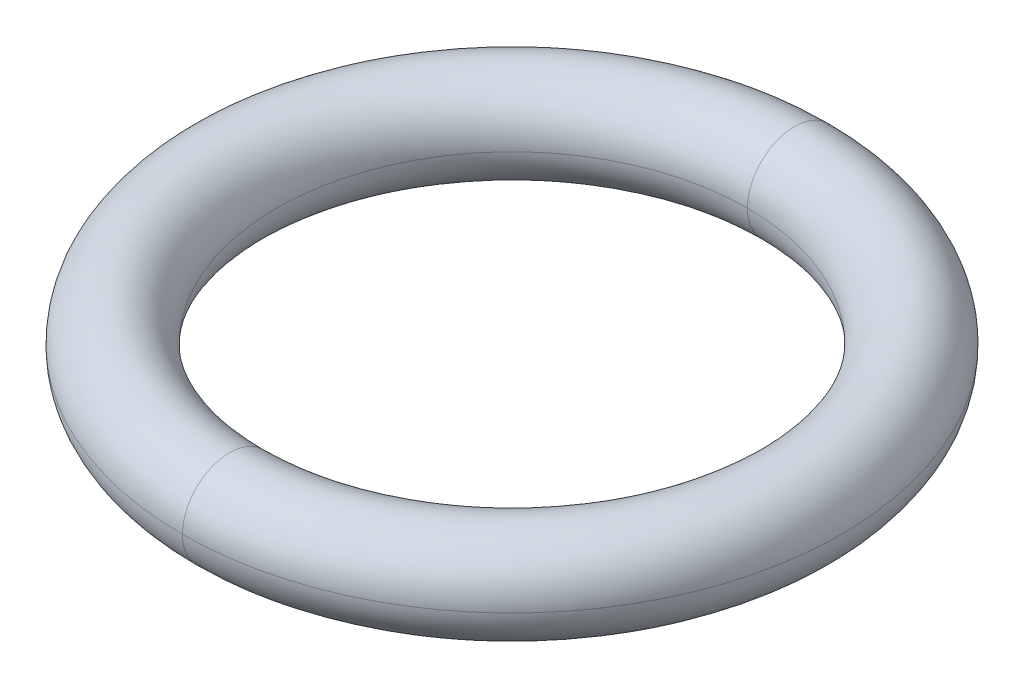
ISO-10303-21;
HEADER;
FILE_DESCRIPTION(('STEP AP214'),'2;1');
FILE_NAME('part.step','',(''),(''),'','','');
FILE_SCHEMA(('AUTOMOTIVE_DESIGN { 1 0 10303 214 1 1 1 1 }'));
ENDSEC;
DATA;
#1=APPLICATION_CONTEXT('core data for automotive mechanical design processes');
#2=APPLICATION_PROTOCOL_DEFINITION('international standard','automotive_design',2000,#1);
#3=PRODUCT_CONTEXT('',#1,'mechanical');
#4=PRODUCT('Part','Part','',(#3));
#5=PRODUCT_RELATED_PRODUCT_CATEGORY('part','',(#4));
#6=PRODUCT_DEFINITION_FORMATION('','',#4);
#7=PRODUCT_DEFINITION_CONTEXT('part definition',#1,'design');
#8=PRODUCT_DEFINITION('design','',#6,#7);
#9=PRODUCT_DEFINITION_SHAPE('','',#8);
#10=(LENGTH_UNIT() NAMED_UNIT(*) SI_UNIT(.MILLI.,.METRE.));
#11=(NAMED_UNIT(*) PLANE_ANGLE_UNIT() SI_UNIT($,.RADIAN.));
#12=(NAMED_UNIT(*) SI_UNIT($,.STERADIAN.) SOLID_ANGLE_UNIT());
#13=UNCERTAINTY_MEASURE_WITH_UNIT(LENGTH_MEASURE(1.E-05),#10,'distance_accuracy_value','');
#14=(GEOMETRIC_REPRESENTATION_CONTEXT(3) GLOBAL_UNCERTAINTY_ASSIGNED_CONTEXT((#13)) GLOBAL_UNIT_ASSIGNED_CONTEXT((#10,
#11,#12)) REPRESENTATION_CONTEXT('',''));
#15=CARTESIAN_POINT('',(0.,0.,0.));
#16=DIRECTION('',(0.,0.,1.));
#17=DIRECTION('',(1.,0.,0.));
#18=AXIS2_PLACEMENT_3D('',#15,#16,#17);
#19=CARTESIAN_POINT('',(0.,0.,0.));
#20=DIRECTION('',(0.,-1.,0.));
#21=DIRECTION('',(0.,0.,-1.));
#22=AXIS2_PLACEMENT_3D('',#19,#20,#21);
#23=TOROIDAL_SURFACE('',#22,1.2,0.2);
#24=CARTESIAN_POINT('',(0.,0.,0.));
#25=DIRECTION('',(0.,-1.,0.));
#26=DIRECTION('',(0.,0.,-1.));
#27=AXIS2_PLACEMENT_3D('',#24,#25,#26);
#28=CIRCLE('',#27,1.4);
#29=CARTESIAN_POINT('',(0.,0.,1.4));
#30=VERTEX_POINT('',#29);
#31=CARTESIAN_POINT('',(0.,0.,-1.4));
#32=VERTEX_POINT('',#31);
#33=EDGE_CURVE('E67',#30,#32,#28,.T.);
#34=ORIENTED_EDGE('',*,*,#33,.F.);
#35=CARTESIAN_POINT('',(0.,0.,1.2));
#36=DIRECTION('',(1.,0.,0.));
#37=DIRECTION('',(0.,0.,-1.));
#38=AXIS2_PLACEMENT_3D('',#35,#36,#37);
#39=CIRCLE('',#38,0.2);
#40=CARTESIAN_POINT('',(0.,0.,1.));
#41=VERTEX_POINT('',#40);
#42=EDGE_CURVE('E11',#41,#30,#39,.T.);
#43=ORIENTED_EDGE('',*,*,#42,.F.);
#44=CARTESIAN_POINT('',(0.,0.,0.));
#45=DIRECTION('',(0.,-1.,0.));
#46=DIRECTION('',(0.,0.,-1.));
#47=AXIS2_PLACEMENT_3D('',#44,#45,#46);
#48=CIRCLE('',#47,1.);
#49=CARTESIAN_POINT('',(0.,0.,-1.));
#50=VERTEX_POINT('',#49);
#51=EDGE_CURVE('E66',#41,#50,#48,.T.);
#52=ORIENTED_EDGE('',*,*,#51,.T.);
#53=CARTESIAN_POINT('',(0.,0.,-1.2));
#54=DIRECTION('',(-1.,0.,0.));
#55=DIRECTION('',(0.,0.,1.));
#56=AXIS2_PLACEMENT_3D('',#53,#54,#55);
#57=CIRCLE('',#56,0.2);
#58=EDGE_CURVE('E21',#50,#32,#57,.T.);
#59=ORIENTED_EDGE('',*,*,#58,.T.);
#60=EDGE_LOOP('',(#34,#43,#52,#59));
#61=FACE_BOUND('',#60,.T.);
#62=ADVANCED_FACE('F17',(#61),#23,.T.);
#63=CARTESIAN_POINT('',(0.,0.,0.));
#64=DIRECTION('',(0.,-1.,0.));
#65=DIRECTION('',(0.,0.,-1.));
#66=AXIS2_PLACEMENT_3D('',#63,#64,#65);
#67=TOROIDAL_SURFACE('',#66,1.2,0.2);
#68=CARTESIAN_POINT('',(0.,0.,0.));
#69=DIRECTION('',(0.,-1.,0.));
#70=DIRECTION('',(0.,0.,-1.));
#71=AXIS2_PLACEMENT_3D('',#68,#69,#70);
#72=CIRCLE('',#71,1.4);
#73=EDGE_CURVE('E53',#32,#30,#72,.T.);
#74=ORIENTED_EDGE('',*,*,#73,.F.);
#75=ORIENTED_EDGE('',*,*,#58,.F.);
#76=CARTESIAN_POINT('',(0.,0.,0.));
#77=DIRECTION('',(0.,-1.,0.));
#78=DIRECTION('',(0.,0.,-1.));
#79=AXIS2_PLACEMENT_3D('',#76,#77,#78);
#80=CIRCLE('',#79,1.);
#81=EDGE_CURVE('E55',#50,#41,#80,.T.);
#82=ORIENTED_EDGE('',*,*,#81,.T.);
#83=ORIENTED_EDGE('',*,*,#42,.T.);
#84=EDGE_LOOP('',(#74,#75,#82,#83));
#85=FACE_BOUND('',#84,.T.);
#86=ADVANCED_FACE('F19',(#85),#67,.T.);
#87=CARTESIAN_POINT('',(0.,0.,0.));
#88=DIRECTION('',(0.,-1.,0.));
#89=DIRECTION('',(0.,0.,-1.));
#90=AXIS2_PLACEMENT_3D('',#87,#88,#89);
#91=TOROIDAL_SURFACE('',#90,1.2,0.2);
#92=CARTESIAN_POINT('',(0.,0.,-1.2));
#93=DIRECTION('',(-1.,0.,0.));
#94=DIRECTION('',(0.,0.,1.));
#95=AXIS2_PLACEMENT_3D('',#92,#93,#94);
#96=CIRCLE('',#95,0.2);
#97=EDGE_CURVE('E63',#32,#50,#96,.T.);
#98=ORIENTED_EDGE('',*,*,#97,.F.);
#99=ORIENTED_EDGE('',*,*,#73,.T.);
#100=CARTESIAN_POINT('',(0.,0.,1.2));
#101=DIRECTION('',(1.,0.,0.));
#102=DIRECTION('',(0.,0.,-1.));
#103=AXIS2_PLACEMENT_3D('',#100,#101,#102);
#104=CIRCLE('',#103,0.2);
#105=EDGE_CURVE('E61',#30,#41,#104,.T.);
#106=ORIENTED_EDGE('',*,*,#105,.T.);
#107=ORIENTED_EDGE('',*,*,#81,.F.);
#108=EDGE_LOOP('',(#98,#99,#106,#107));
#109=FACE_BOUND('',#108,.T.);
#110=ADVANCED_FACE('F59',(#109),#91,.T.);
#111=CARTESIAN_POINT('',(0.,0.,0.));
#112=DIRECTION('',(0.,-1.,0.));
#113=DIRECTION('',(0.,0.,-1.));
#114=AXIS2_PLACEMENT_3D('',#111,#112,#113);
#115=TOROIDAL_SURFACE('',#114,1.2,0.2);
#116=ORIENTED_EDGE('',*,*,#105,.F.);
#117=ORIENTED_EDGE('',*,*,#33,.T.);
#118=ORIENTED_EDGE('',*,*,#97,.T.);
#119=ORIENTED_EDGE('',*,*,#51,.F.);
#120=EDGE_LOOP('',(#116,#117,#118,#119));
#121=FACE_BOUND('',#120,.T.);
#122=ADVANCED_FACE('F71',(#121),#115,.T.);
#123=CLOSED_SHELL('',(#62,#86,#110,#122));
#124=MANIFOLD_SOLID_BREP('B1',#123);
#125=ADVANCED_BREP_SHAPE_REPRESENTATION('',(#18,#124),#14);
#126=SHAPE_DEFINITION_REPRESENTATION(#9,#125);
ENDSEC;
END-ISO-10303-21;
